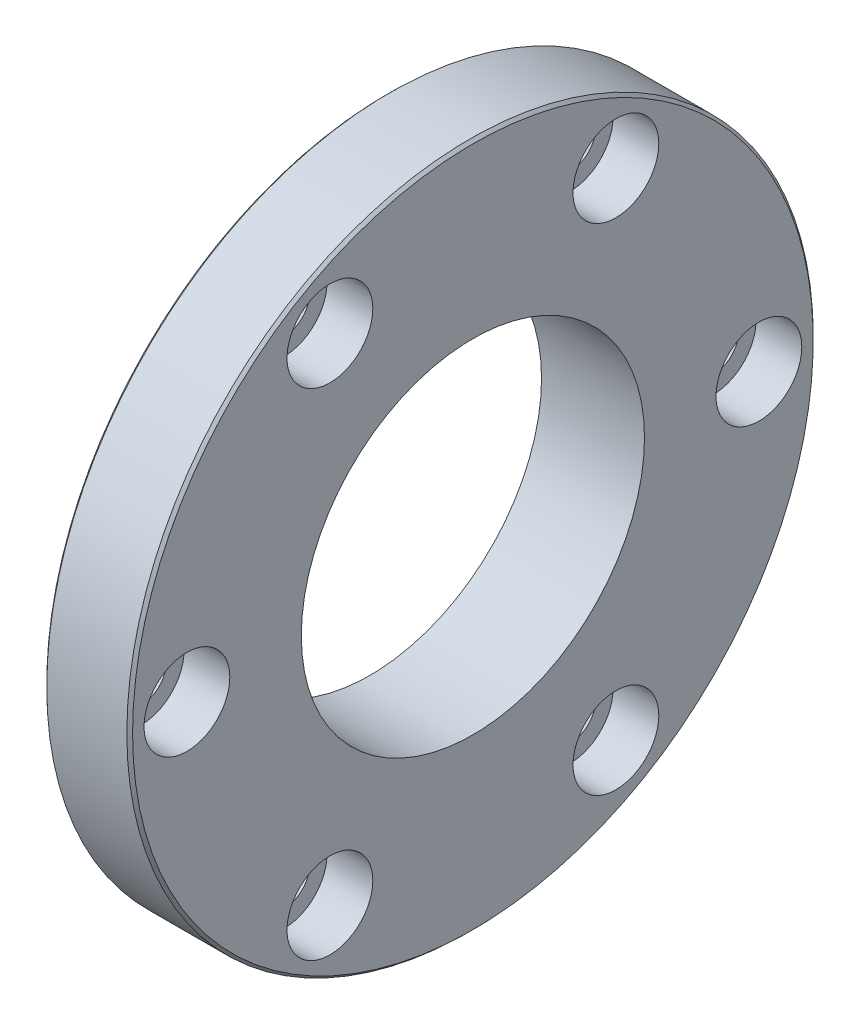
ISO-10303-21;
HEADER;
FILE_DESCRIPTION(('STEP AP214'),'2;1');
FILE_NAME('part.step','',(''),(''),'','','');
FILE_SCHEMA(('AUTOMOTIVE_DESIGN { 1 0 10303 214 1 1 1 1 }'));
ENDSEC;
DATA;
#1=APPLICATION_CONTEXT('core data for automotive mechanical design processes');
#2=APPLICATION_PROTOCOL_DEFINITION('international standard','automotive_design',2000,#1);
#3=PRODUCT_CONTEXT('',#1,'mechanical');
#4=PRODUCT('Part','Part','',(#3));
#5=PRODUCT_RELATED_PRODUCT_CATEGORY('part','',(#4));
#6=PRODUCT_DEFINITION_FORMATION('','',#4);
#7=PRODUCT_DEFINITION_CONTEXT('part definition',#1,'design');
#8=PRODUCT_DEFINITION('design','',#6,#7);
#9=PRODUCT_DEFINITION_SHAPE('','',#8);
#10=(LENGTH_UNIT() NAMED_UNIT(*) SI_UNIT(.MILLI.,.METRE.));
#11=(NAMED_UNIT(*) PLANE_ANGLE_UNIT() SI_UNIT($,.RADIAN.));
#12=(NAMED_UNIT(*) SI_UNIT($,.STERADIAN.) SOLID_ANGLE_UNIT());
#13=UNCERTAINTY_MEASURE_WITH_UNIT(LENGTH_MEASURE(1.E-05),#10,'distance_accuracy_value','');
#14=(GEOMETRIC_REPRESENTATION_CONTEXT(3) GLOBAL_UNCERTAINTY_ASSIGNED_CONTEXT((#13)) GLOBAL_UNIT_ASSIGNED_CONTEXT((#10,
#11,#12)) REPRESENTATION_CONTEXT('',''));
#15=CARTESIAN_POINT('',(0.,0.,0.));
#16=DIRECTION('',(0.,0.,1.));
#17=DIRECTION('',(1.,0.,0.));
#18=AXIS2_PLACEMENT_3D('',#15,#16,#17);
#19=CARTESIAN_POINT('',(-20.,35.,0.));
#20=DIRECTION('',(1.,0.,0.));
#21=DIRECTION('',(0.,0.,-1.));
#22=AXIS2_PLACEMENT_3D('',#19,#20,#21);
#23=PLANE('',#22);
#24=CARTESIAN_POINT('',(-20.,0.,0.));
#25=DIRECTION('',(1.,0.,0.));
#26=DIRECTION('',(0.,0.,-1.));
#27=AXIS2_PLACEMENT_3D('',#24,#25,#26);
#28=CIRCLE('',#27,39.5);
#29=CARTESIAN_POINT('',(-20.,0.,-39.5));
#30=VERTEX_POINT('',#29);
#31=EDGE_CURVE('E27',#30,#30,#28,.F.);
#32=ORIENTED_EDGE('',*,*,#31,.T.);
#33=EDGE_LOOP('',(#32));
#34=FACE_BOUND('',#33,.T.);
#35=CARTESIAN_POINT('',(-20.,0.,0.));
#36=DIRECTION('',(-1.,0.,0.));
#37=DIRECTION('',(0.,0.,1.));
#38=AXIS2_PLACEMENT_3D('',#35,#36,#37);
#39=CIRCLE('',#38,35.);
#40=CARTESIAN_POINT('',(-20.,0.,35.));
#41=VERTEX_POINT('',#40);
#42=EDGE_CURVE('E120',#41,#41,#39,.T.);
#43=ORIENTED_EDGE('',*,*,#42,.F.);
#44=EDGE_LOOP('',(#43));
#45=FACE_BOUND('',#44,.T.);
#46=ADVANCED_FACE('F14',(#34,#45),#23,.F.);
#47=CARTESIAN_POINT('',(-48.4195374503968,0.,0.));
#48=DIRECTION('',(-1.,0.,0.));
#49=DIRECTION('',(0.,0.,1.));
#50=AXIS2_PLACEMENT_3D('',#47,#48,#49);
#51=CYLINDRICAL_SURFACE('',#50,35.);
#52=CARTESIAN_POINT('',(-18.,0.,0.));
#53=DIRECTION('',(-1.,0.,0.));
#54=DIRECTION('',(0.,0.,1.));
#55=AXIS2_PLACEMENT_3D('',#52,#53,#54);
#56=CIRCLE('',#55,35.);
#57=CARTESIAN_POINT('',(-18.,0.,35.));
#58=VERTEX_POINT('',#57);
#59=EDGE_CURVE('E117',#58,#58,#56,.T.);
#60=ORIENTED_EDGE('',*,*,#59,.F.);
#61=EDGE_LOOP('',(#60));
#62=FACE_BOUND('',#61,.T.);
#63=ORIENTED_EDGE('',*,*,#42,.T.);
#64=EDGE_LOOP('',(#63));
#65=FACE_BOUND('',#64,.T.);
#66=ADVANCED_FACE('F153',(#62,#65),#51,.F.);
#67=CARTESIAN_POINT('',(-18.,30.,0.));
#68=DIRECTION('',(1.,0.,0.));
#69=DIRECTION('',(0.,0.,-1.));
#70=AXIS2_PLACEMENT_3D('',#67,#68,#69);
#71=PLANE('',#70);
#72=CARTESIAN_POINT('',(-18.,0.,0.));
#73=DIRECTION('',(-1.,0.,0.));
#74=DIRECTION('',(0.,0.,1.));
#75=AXIS2_PLACEMENT_3D('',#72,#73,#74);
#76=CIRCLE('',#75,30.);
#77=CARTESIAN_POINT('',(-18.,0.,30.));
#78=VERTEX_POINT('',#77);
#79=EDGE_CURVE('E114',#78,#78,#76,.T.);
#80=ORIENTED_EDGE('',*,*,#79,.F.);
#81=EDGE_LOOP('',(#80));
#82=FACE_BOUND('',#81,.T.);
#83=ORIENTED_EDGE('',*,*,#59,.T.);
#84=EDGE_LOOP('',(#83));
#85=FACE_BOUND('',#84,.T.);
#86=ADVANCED_FACE('F159',(#82,#85),#71,.F.);
#87=CARTESIAN_POINT('',(-48.4195374503968,0.,0.));
#88=DIRECTION('',(-1.,0.,0.));
#89=DIRECTION('',(0.,0.,1.));
#90=AXIS2_PLACEMENT_3D('',#87,#88,#89);
#91=CYLINDRICAL_SURFACE('',#90,30.);
#92=CARTESIAN_POINT('',(0.,0.,0.));
#93=DIRECTION('',(-1.,0.,0.));
#94=DIRECTION('',(0.,0.,1.));
#95=AXIS2_PLACEMENT_3D('',#92,#93,#94);
#96=CIRCLE('',#95,30.);
#97=CARTESIAN_POINT('',(0.,0.,30.));
#98=VERTEX_POINT('',#97);
#99=EDGE_CURVE('E111',#98,#98,#96,.T.);
#100=ORIENTED_EDGE('',*,*,#99,.F.);
#101=EDGE_LOOP('',(#100));
#102=FACE_BOUND('',#101,.T.);
#103=ORIENTED_EDGE('',*,*,#79,.T.);
#104=EDGE_LOOP('',(#103));
#105=FACE_BOUND('',#104,.T.);
#106=ADVANCED_FACE('F165',(#102,#105),#91,.F.);
#107=CARTESIAN_POINT('',(0.,60.,0.));
#108=DIRECTION('',(-1.,0.,0.));
#109=DIRECTION('',(0.,0.,1.));
#110=AXIS2_PLACEMENT_3D('',#107,#108,#109);
#111=PLANE('',#110);
#112=CARTESIAN_POINT('',(0.,-43.3012701892216,25.0000000000005));
#113=DIRECTION('',(1.,0.,0.));
#114=DIRECTION('',(0.,0.,-1.));
#115=AXIS2_PLACEMENT_3D('',#112,#113,#114);
#116=CIRCLE('',#115,7.5);
#117=CARTESIAN_POINT('',(0.,-43.3012701892216,17.5000000000005));
#118=VERTEX_POINT('',#117);
#119=EDGE_CURVE('E283',#118,#118,#116,.T.);
#120=ORIENTED_EDGE('',*,*,#119,.F.);
#121=EDGE_LOOP('',(#120));
#122=FACE_BOUND('',#121,.T.);
#123=CARTESIAN_POINT('',(0.,-43.3012701892221,-24.9999999999996));
#124=DIRECTION('',(1.,0.,0.));
#125=DIRECTION('',(0.,0.,-1.));
#126=AXIS2_PLACEMENT_3D('',#123,#124,#125);
#127=CIRCLE('',#126,7.5);
#128=CARTESIAN_POINT('',(0.,-43.3012701892221,-32.4999999999996));
#129=VERTEX_POINT('',#128);
#130=EDGE_CURVE('E65',#129,#129,#127,.T.);
#131=ORIENTED_EDGE('',*,*,#130,.F.);
#132=EDGE_LOOP('',(#131));
#133=FACE_BOUND('',#132,.T.);
#134=CARTESIAN_POINT('',(0.,0.,-50.));
#135=DIRECTION('',(1.,0.,0.));
#136=DIRECTION('',(0.,0.,-1.));
#137=AXIS2_PLACEMENT_3D('',#134,#135,#136);
#138=CIRCLE('',#137,7.5);
#139=CARTESIAN_POINT('',(0.,0.,-57.5));
#140=VERTEX_POINT('',#139);
#141=EDGE_CURVE('E52',#140,#140,#138,.T.);
#142=ORIENTED_EDGE('',*,*,#141,.F.);
#143=EDGE_LOOP('',(#142));
#144=FACE_BOUND('',#143,.T.);
#145=CARTESIAN_POINT('',(0.,43.3012701892218,-25.));
#146=DIRECTION('',(1.,0.,0.));
#147=DIRECTION('',(0.,0.,-1.));
#148=AXIS2_PLACEMENT_3D('',#145,#146,#147);
#149=CIRCLE('',#148,7.5);
#150=CARTESIAN_POINT('',(0.,43.3012701892218,-32.5));
#151=VERTEX_POINT('',#150);
#152=EDGE_CURVE('E48',#151,#151,#149,.T.);
#153=ORIENTED_EDGE('',*,*,#152,.F.);
#154=EDGE_LOOP('',(#153));
#155=FACE_BOUND('',#154,.T.);
#156=CARTESIAN_POINT('',(0.,43.301270189222,25.));
#157=DIRECTION('',(1.,0.,0.));
#158=DIRECTION('',(0.,0.,-1.));
#159=AXIS2_PLACEMENT_3D('',#156,#157,#158);
#160=CIRCLE('',#159,7.5);
#161=CARTESIAN_POINT('',(0.,43.301270189222,17.5));
#162=VERTEX_POINT('',#161);
#163=EDGE_CURVE('E44',#162,#162,#160,.T.);
#164=ORIENTED_EDGE('',*,*,#163,.F.);
#165=EDGE_LOOP('',(#164));
#166=FACE_BOUND('',#165,.T.);
#167=CARTESIAN_POINT('',(0.,0.,50.));
#168=DIRECTION('',(1.,0.,0.));
#169=DIRECTION('',(0.,0.,-1.));
#170=AXIS2_PLACEMENT_3D('',#167,#168,#169);
#171=CIRCLE('',#170,7.5);
#172=CARTESIAN_POINT('',(0.,0.,42.5));
#173=VERTEX_POINT('',#172);
#174=EDGE_CURVE('E39',#173,#173,#171,.T.);
#175=ORIENTED_EDGE('',*,*,#174,.F.);
#176=EDGE_LOOP('',(#175));
#177=FACE_BOUND('',#176,.T.);
#178=CARTESIAN_POINT('',(0.,0.,0.));
#179=DIRECTION('',(-1.,0.,0.));
#180=DIRECTION('',(0.,0.,1.));
#181=AXIS2_PLACEMENT_3D('',#178,#179,#180);
#182=CIRCLE('',#181,59.5);
#183=CARTESIAN_POINT('',(0.,0.,59.5));
#184=VERTEX_POINT('',#183);
#185=EDGE_CURVE('E129',#184,#184,#182,.F.);
#186=ORIENTED_EDGE('',*,*,#185,.T.);
#187=EDGE_LOOP('',(#186));
#188=FACE_BOUND('',#187,.T.);
#189=ORIENTED_EDGE('',*,*,#99,.T.);
#190=EDGE_LOOP('',(#189));
#191=FACE_BOUND('',#190,.T.);
#192=ADVANCED_FACE('F169',(#122,#133,#144,#155,#166,#177,#188,#191),#111,.F.);
#193=CARTESIAN_POINT('',(-48.4195374503968,0.,0.));
#194=DIRECTION('',(-1.,0.,0.));
#195=DIRECTION('',(0.,0.,1.));
#196=AXIS2_PLACEMENT_3D('',#193,#194,#195);
#197=CYLINDRICAL_SURFACE('',#196,60.);
#198=CARTESIAN_POINT('',(-0.500000000000007,0.,0.));
#199=DIRECTION('',(-1.,0.,0.));
#200=DIRECTION('',(0.,0.,1.));
#201=AXIS2_PLACEMENT_3D('',#198,#199,#200);
#202=CIRCLE('',#201,60.);
#203=CARTESIAN_POINT('',(-0.500000000000007,0.,60.));
#204=VERTEX_POINT('',#203);
#205=EDGE_CURVE('E126',#204,#204,#202,.T.);
#206=ORIENTED_EDGE('',*,*,#205,.T.);
#207=EDGE_LOOP('',(#206));
#208=FACE_BOUND('',#207,.T.);
#209=CARTESIAN_POINT('',(-14.5,0.,0.));
#210=DIRECTION('',(1.,0.,0.));
#211=DIRECTION('',(0.,0.,-1.));
#212=AXIS2_PLACEMENT_3D('',#209,#210,#211);
#213=CIRCLE('',#212,60.);
#214=CARTESIAN_POINT('',(-14.5,0.,-60.));
#215=VERTEX_POINT('',#214);
#216=EDGE_CURVE('E123',#215,#215,#213,.T.);
#217=ORIENTED_EDGE('',*,*,#216,.T.);
#218=EDGE_LOOP('',(#217));
#219=FACE_BOUND('',#218,.T.);
#220=ADVANCED_FACE('F173',(#208,#219),#197,.T.);
#221=CARTESIAN_POINT('',(-15.,42.,0.));
#222=DIRECTION('',(1.,0.,0.));
#223=DIRECTION('',(0.,0.,-1.));
#224=AXIS2_PLACEMENT_3D('',#221,#222,#223);
#225=PLANE('',#224);
#226=CARTESIAN_POINT('',(-15.,-43.3012701892216,25.0000000000005));
#227=DIRECTION('',(1.,0.,0.));
#228=DIRECTION('',(0.,0.,-1.));
#229=AXIS2_PLACEMENT_3D('',#226,#227,#228);
#230=CIRCLE('',#229,4.5);
#231=CARTESIAN_POINT('',(-15.,-43.3012701892216,20.5000000000005));
#232=VERTEX_POINT('',#231);
#233=EDGE_CURVE('E18',#232,#232,#230,.T.);
#234=ORIENTED_EDGE('',*,*,#233,.T.);
#235=EDGE_LOOP('',(#234));
#236=FACE_BOUND('',#235,.T.);
#237=CARTESIAN_POINT('',(-15.,-43.3012701892221,-24.9999999999996));
#238=DIRECTION('',(1.,0.,0.));
#239=DIRECTION('',(0.,0.,-1.));
#240=AXIS2_PLACEMENT_3D('',#237,#238,#239);
#241=CIRCLE('',#240,4.5);
#242=CARTESIAN_POINT('',(-15.,-43.3012701892221,-29.4999999999996));
#243=VERTEX_POINT('',#242);
#244=EDGE_CURVE('E50',#243,#243,#241,.T.);
#245=ORIENTED_EDGE('',*,*,#244,.T.);
#246=EDGE_LOOP('',(#245));
#247=FACE_BOUND('',#246,.T.);
#248=CARTESIAN_POINT('',(-15.,0.,-50.));
#249=DIRECTION('',(1.,0.,0.));
#250=DIRECTION('',(0.,0.,-1.));
#251=AXIS2_PLACEMENT_3D('',#248,#249,#250);
#252=CIRCLE('',#251,4.5);
#253=CARTESIAN_POINT('',(-15.,0.,-54.5));
#254=VERTEX_POINT('',#253);
#255=EDGE_CURVE('E46',#254,#254,#252,.T.);
#256=ORIENTED_EDGE('',*,*,#255,.T.);
#257=EDGE_LOOP('',(#256));
#258=FACE_BOUND('',#257,.T.);
#259=CARTESIAN_POINT('',(-15.,43.3012701892218,-25.));
#260=DIRECTION('',(1.,0.,0.));
#261=DIRECTION('',(0.,0.,-1.));
#262=AXIS2_PLACEMENT_3D('',#259,#260,#261);
#263=CIRCLE('',#262,4.5);
#264=CARTESIAN_POINT('',(-15.,43.3012701892218,-29.5));
#265=VERTEX_POINT('',#264);
#266=EDGE_CURVE('E41',#265,#265,#263,.T.);
#267=ORIENTED_EDGE('',*,*,#266,.T.);
#268=EDGE_LOOP('',(#267));
#269=FACE_BOUND('',#268,.T.);
#270=CARTESIAN_POINT('',(-15.,43.301270189222,25.));
#271=DIRECTION('',(1.,0.,0.));
#272=DIRECTION('',(0.,0.,-1.));
#273=AXIS2_PLACEMENT_3D('',#270,#271,#272);
#274=CIRCLE('',#273,4.5);
#275=CARTESIAN_POINT('',(-15.,43.301270189222,20.5));
#276=VERTEX_POINT('',#275);
#277=EDGE_CURVE('E36',#276,#276,#274,.T.);
#278=ORIENTED_EDGE('',*,*,#277,.T.);
#279=EDGE_LOOP('',(#278));
#280=FACE_BOUND('',#279,.T.);
#281=CARTESIAN_POINT('',(-15.,0.,50.));
#282=DIRECTION('',(1.,0.,0.));
#283=DIRECTION('',(0.,0.,-1.));
#284=AXIS2_PLACEMENT_3D('',#281,#282,#283);
#285=CIRCLE('',#284,4.5);
#286=CARTESIAN_POINT('',(-15.,0.,45.5));
#287=VERTEX_POINT('',#286);
#288=EDGE_CURVE('E31',#287,#287,#285,.T.);
#289=ORIENTED_EDGE('',*,*,#288,.T.);
#290=EDGE_LOOP('',(#289));
#291=FACE_BOUND('',#290,.T.);
#292=CARTESIAN_POINT('',(-15.,0.,0.));
#293=DIRECTION('',(1.,0.,0.));
#294=DIRECTION('',(0.,0.,-1.));
#295=AXIS2_PLACEMENT_3D('',#292,#293,#294);
#296=CIRCLE('',#295,59.5);
#297=CARTESIAN_POINT('',(-15.,0.,-59.5));
#298=VERTEX_POINT('',#297);
#299=EDGE_CURVE('E10',#298,#298,#296,.F.);
#300=ORIENTED_EDGE('',*,*,#299,.T.);
#301=EDGE_LOOP('',(#300));
#302=FACE_BOUND('',#301,.T.);
#303=CARTESIAN_POINT('',(-15.,0.,0.));
#304=DIRECTION('',(-1.,0.,0.));
#305=DIRECTION('',(0.,0.,1.));
#306=AXIS2_PLACEMENT_3D('',#303,#304,#305);
#307=CIRCLE('',#306,42.);
#308=CARTESIAN_POINT('',(-15.,0.,42.));
#309=VERTEX_POINT('',#308);
#310=EDGE_CURVE('E108',#309,#309,#307,.T.);
#311=ORIENTED_EDGE('',*,*,#310,.F.);
#312=EDGE_LOOP('',(#311));
#313=FACE_BOUND('',#312,.T.);
#314=ADVANCED_FACE('F177',(#236,#247,#258,#269,#280,#291,#302,#313),#225,.F.);
#315=CARTESIAN_POINT('',(-15.,0.,0.));
#316=DIRECTION('',(-1.,0.,0.));
#317=DIRECTION('',(0.,0.,1.));
#318=AXIS2_PLACEMENT_3D('',#315,#316,#317);
#319=CONICAL_SURFACE('',#318,42.,0.785398163397455);
#320=CARTESIAN_POINT('',(-14.5,0.,0.));
#321=DIRECTION('',(-1.,0.,0.));
#322=DIRECTION('',(0.,0.,1.));
#323=AXIS2_PLACEMENT_3D('',#320,#321,#322);
#324=CIRCLE('',#323,41.5);
#325=CARTESIAN_POINT('',(-14.5,0.,41.5));
#326=VERTEX_POINT('',#325);
#327=EDGE_CURVE('E105',#326,#326,#324,.T.);
#328=ORIENTED_EDGE('',*,*,#327,.F.);
#329=EDGE_LOOP('',(#328));
#330=FACE_BOUND('',#329,.T.);
#331=ORIENTED_EDGE('',*,*,#310,.T.);
#332=EDGE_LOOP('',(#331));
#333=FACE_BOUND('',#332,.T.);
#334=ADVANCED_FACE('F181',(#330,#333),#319,.F.);
#335=CARTESIAN_POINT('',(-14.5,41.5,0.));
#336=DIRECTION('',(1.,0.,0.));
#337=DIRECTION('',(0.,0.,-1.));
#338=AXIS2_PLACEMENT_3D('',#335,#336,#337);
#339=PLANE('',#338);
#340=CARTESIAN_POINT('',(-14.5,0.,0.));
#341=DIRECTION('',(-1.,0.,0.));
#342=DIRECTION('',(0.,0.,1.));
#343=AXIS2_PLACEMENT_3D('',#340,#341,#342);
#344=CIRCLE('',#343,40.);
#345=CARTESIAN_POINT('',(-14.5,0.,40.));
#346=VERTEX_POINT('',#345);
#347=EDGE_CURVE('E102',#346,#346,#344,.T.);
#348=ORIENTED_EDGE('',*,*,#347,.F.);
#349=EDGE_LOOP('',(#348));
#350=FACE_BOUND('',#349,.T.);
#351=ORIENTED_EDGE('',*,*,#327,.T.);
#352=EDGE_LOOP('',(#351));
#353=FACE_BOUND('',#352,.T.);
#354=ADVANCED_FACE('F185',(#350,#353),#339,.F.);
#355=CARTESIAN_POINT('',(-15.,0.,0.));
#356=DIRECTION('',(-1.,0.,0.));
#357=DIRECTION('',(0.,0.,1.));
#358=AXIS2_PLACEMENT_3D('',#355,#356,#357);
#359=TOROIDAL_SURFACE('',#358,40.,0.5);
#360=CARTESIAN_POINT('',(-15.,0.,0.));
#361=DIRECTION('',(-1.,0.,0.));
#362=DIRECTION('',(0.,0.,1.));
#363=AXIS2_PLACEMENT_3D('',#360,#361,#362);
#364=CIRCLE('',#363,39.5);
#365=CARTESIAN_POINT('',(-15.,0.,39.5));
#366=VERTEX_POINT('',#365);
#367=EDGE_CURVE('E99',#366,#366,#364,.T.);
#368=ORIENTED_EDGE('',*,*,#367,.F.);
#369=EDGE_LOOP('',(#368));
#370=FACE_BOUND('',#369,.T.);
#371=ORIENTED_EDGE('',*,*,#347,.T.);
#372=EDGE_LOOP('',(#371));
#373=FACE_BOUND('',#372,.T.);
#374=ADVANCED_FACE('F189',(#370,#373),#359,.F.);
#375=CARTESIAN_POINT('',(-48.4195374503968,0.,0.));
#376=DIRECTION('',(-1.,0.,0.));
#377=DIRECTION('',(0.,0.,1.));
#378=AXIS2_PLACEMENT_3D('',#375,#376,#377);
#379=CYLINDRICAL_SURFACE('',#378,39.5);
#380=CARTESIAN_POINT('',(-16.5,0.,0.));
#381=DIRECTION('',(-1.,0.,0.));
#382=DIRECTION('',(0.,0.,1.));
#383=AXIS2_PLACEMENT_3D('',#380,#381,#382);
#384=CIRCLE('',#383,39.5);
#385=CARTESIAN_POINT('',(-16.5,0.,39.5));
#386=VERTEX_POINT('',#385);
#387=EDGE_CURVE('E96',#386,#386,#384,.T.);
#388=ORIENTED_EDGE('',*,*,#387,.F.);
#389=EDGE_LOOP('',(#388));
#390=FACE_BOUND('',#389,.T.);
#391=ORIENTED_EDGE('',*,*,#367,.T.);
#392=EDGE_LOOP('',(#391));
#393=FACE_BOUND('',#392,.T.);
#394=ADVANCED_FACE('F193',(#390,#393),#379,.T.);
#395=CARTESIAN_POINT('',(-16.5,0.,0.));
#396=DIRECTION('',(-1.,0.,0.));
#397=DIRECTION('',(0.,0.,1.));
#398=AXIS2_PLACEMENT_3D('',#395,#396,#397);
#399=CONICAL_SURFACE('',#398,39.5,0.785398163397442);
#400=CARTESIAN_POINT('',(-17.,0.,0.));
#401=DIRECTION('',(-1.,0.,0.));
#402=DIRECTION('',(0.,0.,1.));
#403=AXIS2_PLACEMENT_3D('',#400,#401,#402);
#404=CIRCLE('',#403,40.);
#405=CARTESIAN_POINT('',(-17.,0.,40.));
#406=VERTEX_POINT('',#405);
#407=EDGE_CURVE('E34',#406,#406,#404,.T.);
#408=ORIENTED_EDGE('',*,*,#407,.F.);
#409=EDGE_LOOP('',(#408));
#410=FACE_BOUND('',#409,.T.);
#411=ORIENTED_EDGE('',*,*,#387,.T.);
#412=EDGE_LOOP('',(#411));
#413=FACE_BOUND('',#412,.T.);
#414=ADVANCED_FACE('F197',(#410,#413),#399,.T.);
#415=CARTESIAN_POINT('',(-48.4195374503968,0.,0.));
#416=DIRECTION('',(-1.,0.,0.));
#417=DIRECTION('',(0.,0.,1.));
#418=AXIS2_PLACEMENT_3D('',#415,#416,#417);
#419=CYLINDRICAL_SURFACE('',#418,40.);
#420=CARTESIAN_POINT('',(-19.5,0.,0.));
#421=DIRECTION('',(1.,0.,0.));
#422=DIRECTION('',(0.,0.,-1.));
#423=AXIS2_PLACEMENT_3D('',#420,#421,#422);
#424=CIRCLE('',#423,40.);
#425=CARTESIAN_POINT('',(-19.5,0.,-40.));
#426=VERTEX_POINT('',#425);
#427=EDGE_CURVE('E22',#426,#426,#424,.T.);
#428=ORIENTED_EDGE('',*,*,#427,.T.);
#429=EDGE_LOOP('',(#428));
#430=FACE_BOUND('',#429,.T.);
#431=ORIENTED_EDGE('',*,*,#407,.T.);
#432=EDGE_LOOP('',(#431));
#433=FACE_BOUND('',#432,.T.);
#434=ADVANCED_FACE('F148',(#430,#433),#419,.T.);
#435=CARTESIAN_POINT('',(-0.500000000000007,0.,0.));
#436=DIRECTION('',(-1.,0.,0.));
#437=DIRECTION('',(0.,0.,1.));
#438=AXIS2_PLACEMENT_3D('',#435,#436,#437);
#439=CONICAL_SURFACE('',#438,60.,0.785398163397455);
#440=ORIENTED_EDGE('',*,*,#185,.F.);
#441=EDGE_LOOP('',(#440));
#442=FACE_BOUND('',#441,.T.);
#443=ORIENTED_EDGE('',*,*,#205,.F.);
#444=EDGE_LOOP('',(#443));
#445=FACE_BOUND('',#444,.T.);
#446=ADVANCED_FACE('F138',(#442,#445),#439,.T.);
#447=CARTESIAN_POINT('',(-20.,0.,0.));
#448=DIRECTION('',(1.,0.,0.));
#449=DIRECTION('',(0.,0.,-1.));
#450=AXIS2_PLACEMENT_3D('',#447,#448,#449);
#451=CONICAL_SURFACE('',#450,39.5,0.785398163397462);
#452=ORIENTED_EDGE('',*,*,#427,.F.);
#453=EDGE_LOOP('',(#452));
#454=FACE_BOUND('',#453,.T.);
#455=ORIENTED_EDGE('',*,*,#31,.F.);
#456=EDGE_LOOP('',(#455));
#457=FACE_BOUND('',#456,.T.);
#458=ADVANCED_FACE('F136',(#454,#457),#451,.T.);
#459=CARTESIAN_POINT('',(-15.,0.,0.));
#460=DIRECTION('',(1.,0.,0.));
#461=DIRECTION('',(0.,0.,-1.));
#462=AXIS2_PLACEMENT_3D('',#459,#460,#461);
#463=CONICAL_SURFACE('',#462,59.5,0.785398163397469);
#464=ORIENTED_EDGE('',*,*,#216,.F.);
#465=EDGE_LOOP('',(#464));
#466=FACE_BOUND('',#465,.T.);
#467=ORIENTED_EDGE('',*,*,#299,.F.);
#468=EDGE_LOOP('',(#467));
#469=FACE_BOUND('',#468,.T.);
#470=ADVANCED_FACE('F16',(#466,#469),#463,.T.);
#471=CARTESIAN_POINT('',(0.,0.,50.));
#472=DIRECTION('',(1.,0.,0.));
#473=DIRECTION('',(0.,0.,-1.));
#474=AXIS2_PLACEMENT_3D('',#471,#472,#473);
#475=CYLINDRICAL_SURFACE('',#474,4.5);
#476=CARTESIAN_POINT('',(-8.,0.,50.));
#477=DIRECTION('',(1.,0.,0.));
#478=DIRECTION('',(0.,0.,-1.));
#479=AXIS2_PLACEMENT_3D('',#476,#477,#478);
#480=CIRCLE('',#479,4.5);
#481=CARTESIAN_POINT('',(-8.,0.,45.5));
#482=VERTEX_POINT('',#481);
#483=EDGE_CURVE('E35',#482,#482,#480,.T.);
#484=ORIENTED_EDGE('',*,*,#483,.T.);
#485=EDGE_LOOP('',(#484));
#486=FACE_BOUND('',#485,.T.);
#487=ORIENTED_EDGE('',*,*,#288,.F.);
#488=EDGE_LOOP('',(#487));
#489=FACE_BOUND('',#488,.T.);
#490=ADVANCED_FACE('F146',(#486,#489),#475,.F.);
#491=CARTESIAN_POINT('',(-8.,4.5,50.));
#492=DIRECTION('',(-1.,0.,0.));
#493=DIRECTION('',(0.,0.,1.));
#494=AXIS2_PLACEMENT_3D('',#491,#492,#493);
#495=PLANE('',#494);
#496=ORIENTED_EDGE('',*,*,#483,.F.);
#497=EDGE_LOOP('',(#496));
#498=FACE_BOUND('',#497,.T.);
#499=CARTESIAN_POINT('',(-8.,0.,50.));
#500=DIRECTION('',(1.,0.,0.));
#501=DIRECTION('',(0.,0.,-1.));
#502=AXIS2_PLACEMENT_3D('',#499,#500,#501);
#503=CIRCLE('',#502,7.5);
#504=CARTESIAN_POINT('',(-8.,0.,42.5));
#505=VERTEX_POINT('',#504);
#506=EDGE_CURVE('E89',#505,#505,#503,.T.);
#507=ORIENTED_EDGE('',*,*,#506,.T.);
#508=EDGE_LOOP('',(#507));
#509=FACE_BOUND('',#508,.T.);
#510=ADVANCED_FACE('F207',(#498,#509),#495,.F.);
#511=CARTESIAN_POINT('',(0.,0.,50.));
#512=DIRECTION('',(1.,0.,0.));
#513=DIRECTION('',(0.,0.,-1.));
#514=AXIS2_PLACEMENT_3D('',#511,#512,#513);
#515=CYLINDRICAL_SURFACE('',#514,7.5);
#516=ORIENTED_EDGE('',*,*,#506,.F.);
#517=EDGE_LOOP('',(#516));
#518=FACE_BOUND('',#517,.T.);
#519=ORIENTED_EDGE('',*,*,#174,.T.);
#520=EDGE_LOOP('',(#519));
#521=FACE_BOUND('',#520,.T.);
#522=ADVANCED_FACE('F211',(#518,#521),#515,.F.);
#523=CARTESIAN_POINT('',(0.,43.301270189222,25.));
#524=DIRECTION('',(1.,0.,0.));
#525=DIRECTION('',(0.,0.,-1.));
#526=AXIS2_PLACEMENT_3D('',#523,#524,#525);
#527=CYLINDRICAL_SURFACE('',#526,4.5);
#528=CARTESIAN_POINT('',(-8.,43.301270189222,25.));
#529=DIRECTION('',(1.,0.,0.));
#530=DIRECTION('',(0.,0.,-1.));
#531=AXIS2_PLACEMENT_3D('',#528,#529,#530);
#532=CIRCLE('',#531,4.5);
#533=CARTESIAN_POINT('',(-8.,43.301270189222,20.5));
#534=VERTEX_POINT('',#533);
#535=EDGE_CURVE('E40',#534,#534,#532,.T.);
#536=ORIENTED_EDGE('',*,*,#535,.T.);
#537=EDGE_LOOP('',(#536));
#538=FACE_BOUND('',#537,.T.);
#539=ORIENTED_EDGE('',*,*,#277,.F.);
#540=EDGE_LOOP('',(#539));
#541=FACE_BOUND('',#540,.T.);
#542=ADVANCED_FACE('F215',(#538,#541),#527,.F.);
#543=CARTESIAN_POINT('',(-8.,47.801270189222,25.));
#544=DIRECTION('',(-1.,0.,0.));
#545=DIRECTION('',(0.,0.,1.));
#546=AXIS2_PLACEMENT_3D('',#543,#544,#545);
#547=PLANE('',#546);
#548=ORIENTED_EDGE('',*,*,#535,.F.);
#549=EDGE_LOOP('',(#548));
#550=FACE_BOUND('',#549,.T.);
#551=CARTESIAN_POINT('',(-8.,43.301270189222,25.));
#552=DIRECTION('',(1.,0.,0.));
#553=DIRECTION('',(0.,0.,-1.));
#554=AXIS2_PLACEMENT_3D('',#551,#552,#553);
#555=CIRCLE('',#554,7.5);
#556=CARTESIAN_POINT('',(-8.,43.301270189222,17.5));
#557=VERTEX_POINT('',#556);
#558=EDGE_CURVE('E82',#557,#557,#555,.T.);
#559=ORIENTED_EDGE('',*,*,#558,.T.);
#560=EDGE_LOOP('',(#559));
#561=FACE_BOUND('',#560,.T.);
#562=ADVANCED_FACE('F219',(#550,#561),#547,.F.);
#563=CARTESIAN_POINT('',(0.,43.301270189222,25.));
#564=DIRECTION('',(1.,0.,0.));
#565=DIRECTION('',(0.,0.,-1.));
#566=AXIS2_PLACEMENT_3D('',#563,#564,#565);
#567=CYLINDRICAL_SURFACE('',#566,7.5);
#568=ORIENTED_EDGE('',*,*,#558,.F.);
#569=EDGE_LOOP('',(#568));
#570=FACE_BOUND('',#569,.T.);
#571=ORIENTED_EDGE('',*,*,#163,.T.);
#572=EDGE_LOOP('',(#571));
#573=FACE_BOUND('',#572,.T.);
#574=ADVANCED_FACE('F223',(#570,#573),#567,.F.);
#575=CARTESIAN_POINT('',(0.,43.3012701892218,-25.));
#576=DIRECTION('',(1.,0.,0.));
#577=DIRECTION('',(0.,0.,-1.));
#578=AXIS2_PLACEMENT_3D('',#575,#576,#577);
#579=CYLINDRICAL_SURFACE('',#578,4.5);
#580=CARTESIAN_POINT('',(-8.,43.3012701892218,-25.));
#581=DIRECTION('',(1.,0.,0.));
#582=DIRECTION('',(0.,0.,-1.));
#583=AXIS2_PLACEMENT_3D('',#580,#581,#582);
#584=CIRCLE('',#583,4.5);
#585=CARTESIAN_POINT('',(-8.,43.3012701892218,-29.5));
#586=VERTEX_POINT('',#585);
#587=EDGE_CURVE('E45',#586,#586,#584,.T.);
#588=ORIENTED_EDGE('',*,*,#587,.T.);
#589=EDGE_LOOP('',(#588));
#590=FACE_BOUND('',#589,.T.);
#591=ORIENTED_EDGE('',*,*,#266,.F.);
#592=EDGE_LOOP('',(#591));
#593=FACE_BOUND('',#592,.T.);
#594=ADVANCED_FACE('F227',(#590,#593),#579,.F.);
#595=CARTESIAN_POINT('',(-8.,47.8012701892218,-25.));
#596=DIRECTION('',(-1.,0.,0.));
#597=DIRECTION('',(0.,0.,1.));
#598=AXIS2_PLACEMENT_3D('',#595,#596,#597);
#599=PLANE('',#598);
#600=ORIENTED_EDGE('',*,*,#587,.F.);
#601=EDGE_LOOP('',(#600));
#602=FACE_BOUND('',#601,.T.);
#603=CARTESIAN_POINT('',(-8.,43.3012701892218,-25.));
#604=DIRECTION('',(1.,0.,0.));
#605=DIRECTION('',(0.,0.,-1.));
#606=AXIS2_PLACEMENT_3D('',#603,#604,#605);
#607=CIRCLE('',#606,7.5);
#608=CARTESIAN_POINT('',(-8.,43.3012701892218,-32.5));
#609=VERTEX_POINT('',#608);
#610=EDGE_CURVE('E75',#609,#609,#607,.T.);
#611=ORIENTED_EDGE('',*,*,#610,.T.);
#612=EDGE_LOOP('',(#611));
#613=FACE_BOUND('',#612,.T.);
#614=ADVANCED_FACE('F231',(#602,#613),#599,.F.);
#615=CARTESIAN_POINT('',(0.,43.3012701892218,-25.));
#616=DIRECTION('',(1.,0.,0.));
#617=DIRECTION('',(0.,0.,-1.));
#618=AXIS2_PLACEMENT_3D('',#615,#616,#617);
#619=CYLINDRICAL_SURFACE('',#618,7.5);
#620=ORIENTED_EDGE('',*,*,#610,.F.);
#621=EDGE_LOOP('',(#620));
#622=FACE_BOUND('',#621,.T.);
#623=ORIENTED_EDGE('',*,*,#152,.T.);
#624=EDGE_LOOP('',(#623));
#625=FACE_BOUND('',#624,.T.);
#626=ADVANCED_FACE('F235',(#622,#625),#619,.F.);
#627=CARTESIAN_POINT('',(0.,0.,-50.));
#628=DIRECTION('',(1.,0.,0.));
#629=DIRECTION('',(0.,0.,-1.));
#630=AXIS2_PLACEMENT_3D('',#627,#628,#629);
#631=CYLINDRICAL_SURFACE('',#630,4.5);
#632=CARTESIAN_POINT('',(-8.,0.,-50.));
#633=DIRECTION('',(1.,0.,0.));
#634=DIRECTION('',(0.,0.,-1.));
#635=AXIS2_PLACEMENT_3D('',#632,#633,#634);
#636=CIRCLE('',#635,4.5);
#637=CARTESIAN_POINT('',(-8.,0.,-54.5));
#638=VERTEX_POINT('',#637);
#639=EDGE_CURVE('E49',#638,#638,#636,.T.);
#640=ORIENTED_EDGE('',*,*,#639,.T.);
#641=EDGE_LOOP('',(#640));
#642=FACE_BOUND('',#641,.T.);
#643=ORIENTED_EDGE('',*,*,#255,.F.);
#644=EDGE_LOOP('',(#643));
#645=FACE_BOUND('',#644,.T.);
#646=ADVANCED_FACE('F239',(#642,#645),#631,.F.);
#647=CARTESIAN_POINT('',(-8.,4.5,-50.));
#648=DIRECTION('',(-1.,0.,0.));
#649=DIRECTION('',(0.,0.,1.));
#650=AXIS2_PLACEMENT_3D('',#647,#648,#649);
#651=PLANE('',#650);
#652=ORIENTED_EDGE('',*,*,#639,.F.);
#653=EDGE_LOOP('',(#652));
#654=FACE_BOUND('',#653,.T.);
#655=CARTESIAN_POINT('',(-8.,0.,-50.));
#656=DIRECTION('',(1.,0.,0.));
#657=DIRECTION('',(0.,0.,-1.));
#658=AXIS2_PLACEMENT_3D('',#655,#656,#657);
#659=CIRCLE('',#658,7.5);
#660=CARTESIAN_POINT('',(-8.,0.,-57.5));
#661=VERTEX_POINT('',#660);
#662=EDGE_CURVE('E57',#661,#661,#659,.T.);
#663=ORIENTED_EDGE('',*,*,#662,.T.);
#664=EDGE_LOOP('',(#663));
#665=FACE_BOUND('',#664,.T.);
#666=ADVANCED_FACE('F243',(#654,#665),#651,.F.);
#667=CARTESIAN_POINT('',(0.,0.,-50.));
#668=DIRECTION('',(1.,0.,0.));
#669=DIRECTION('',(0.,0.,-1.));
#670=AXIS2_PLACEMENT_3D('',#667,#668,#669);
#671=CYLINDRICAL_SURFACE('',#670,7.5);
#672=ORIENTED_EDGE('',*,*,#662,.F.);
#673=EDGE_LOOP('',(#672));
#674=FACE_BOUND('',#673,.T.);
#675=ORIENTED_EDGE('',*,*,#141,.T.);
#676=EDGE_LOOP('',(#675));
#677=FACE_BOUND('',#676,.T.);
#678=ADVANCED_FACE('F247',(#674,#677),#671,.F.);
#679=CARTESIAN_POINT('',(0.,-43.3012701892221,-24.9999999999996));
#680=DIRECTION('',(1.,0.,0.));
#681=DIRECTION('',(0.,0.,-1.));
#682=AXIS2_PLACEMENT_3D('',#679,#680,#681);
#683=CYLINDRICAL_SURFACE('',#682,4.5);
#684=CARTESIAN_POINT('',(-8.,-43.3012701892221,-24.9999999999996));
#685=DIRECTION('',(1.,0.,0.));
#686=DIRECTION('',(0.,0.,-1.));
#687=AXIS2_PLACEMENT_3D('',#684,#685,#686);
#688=CIRCLE('',#687,4.5);
#689=CARTESIAN_POINT('',(-8.,-43.3012701892221,-29.4999999999996));
#690=VERTEX_POINT('',#689);
#691=EDGE_CURVE('E53',#690,#690,#688,.T.);
#692=ORIENTED_EDGE('',*,*,#691,.T.);
#693=EDGE_LOOP('',(#692));
#694=FACE_BOUND('',#693,.T.);
#695=ORIENTED_EDGE('',*,*,#244,.F.);
#696=EDGE_LOOP('',(#695));
#697=FACE_BOUND('',#696,.T.);
#698=ADVANCED_FACE('F251',(#694,#697),#683,.F.);
#699=CARTESIAN_POINT('',(-8.,-38.8012701892222,-24.9999999999996));
#700=DIRECTION('',(-1.,0.,0.));
#701=DIRECTION('',(0.,0.,1.));
#702=AXIS2_PLACEMENT_3D('',#699,#700,#701);
#703=PLANE('',#702);
#704=ORIENTED_EDGE('',*,*,#691,.F.);
#705=EDGE_LOOP('',(#704));
#706=FACE_BOUND('',#705,.T.);
#707=CARTESIAN_POINT('',(-8.,-43.3012701892221,-24.9999999999996));
#708=DIRECTION('',(1.,0.,0.));
#709=DIRECTION('',(0.,0.,-1.));
#710=AXIS2_PLACEMENT_3D('',#707,#708,#709);
#711=CIRCLE('',#710,7.5);
#712=CARTESIAN_POINT('',(-8.,-43.3012701892221,-32.4999999999996));
#713=VERTEX_POINT('',#712);
#714=EDGE_CURVE('E60',#713,#713,#711,.T.);
#715=ORIENTED_EDGE('',*,*,#714,.T.);
#716=EDGE_LOOP('',(#715));
#717=FACE_BOUND('',#716,.T.);
#718=ADVANCED_FACE('F255',(#706,#717),#703,.F.);
#719=CARTESIAN_POINT('',(0.,-43.3012701892221,-24.9999999999996));
#720=DIRECTION('',(1.,0.,0.));
#721=DIRECTION('',(0.,0.,-1.));
#722=AXIS2_PLACEMENT_3D('',#719,#720,#721);
#723=CYLINDRICAL_SURFACE('',#722,7.5);
#724=ORIENTED_EDGE('',*,*,#714,.F.);
#725=EDGE_LOOP('',(#724));
#726=FACE_BOUND('',#725,.T.);
#727=ORIENTED_EDGE('',*,*,#130,.T.);
#728=EDGE_LOOP('',(#727));
#729=FACE_BOUND('',#728,.T.);
#730=ADVANCED_FACE('F258',(#726,#729),#723,.F.);
#731=CARTESIAN_POINT('',(0.,-43.3012701892216,25.0000000000005));
#732=DIRECTION('',(1.,0.,0.));
#733=DIRECTION('',(0.,0.,-1.));
#734=AXIS2_PLACEMENT_3D('',#731,#732,#733);
#735=CYLINDRICAL_SURFACE('',#734,4.5);
#736=CARTESIAN_POINT('',(-8.,-43.3012701892216,25.0000000000005));
#737=DIRECTION('',(1.,0.,0.));
#738=DIRECTION('',(0.,0.,-1.));
#739=AXIS2_PLACEMENT_3D('',#736,#737,#738);
#740=CIRCLE('',#739,4.5);
#741=CARTESIAN_POINT('',(-8.,-43.3012701892216,20.5000000000005));
#742=VERTEX_POINT('',#741);
#743=EDGE_CURVE('E285',#742,#742,#740,.T.);
#744=ORIENTED_EDGE('',*,*,#743,.T.);
#745=EDGE_LOOP('',(#744));
#746=FACE_BOUND('',#745,.T.);
#747=ORIENTED_EDGE('',*,*,#233,.F.);
#748=EDGE_LOOP('',(#747));
#749=FACE_BOUND('',#748,.T.);
#750=ADVANCED_FACE('F262',(#746,#749),#735,.F.);
#751=CARTESIAN_POINT('',(-8.,-38.8012701892217,25.0000000000005));
#752=DIRECTION('',(-1.,0.,0.));
#753=DIRECTION('',(0.,0.,1.));
#754=AXIS2_PLACEMENT_3D('',#751,#752,#753);
#755=PLANE('',#754);
#756=ORIENTED_EDGE('',*,*,#743,.F.);
#757=EDGE_LOOP('',(#756));
#758=FACE_BOUND('',#757,.T.);
#759=CARTESIAN_POINT('',(-8.,-43.3012701892216,25.0000000000005));
#760=DIRECTION('',(1.,0.,0.));
#761=DIRECTION('',(0.,0.,-1.));
#762=AXIS2_PLACEMENT_3D('',#759,#760,#761);
#763=CIRCLE('',#762,7.5);
#764=CARTESIAN_POINT('',(-8.,-43.3012701892216,17.5000000000005));
#765=VERTEX_POINT('',#764);
#766=EDGE_CURVE('E280',#765,#765,#763,.T.);
#767=ORIENTED_EDGE('',*,*,#766,.T.);
#768=EDGE_LOOP('',(#767));
#769=FACE_BOUND('',#768,.T.);
#770=ADVANCED_FACE('F266',(#758,#769),#755,.F.);
#771=CARTESIAN_POINT('',(0.,-43.3012701892216,25.0000000000005));
#772=DIRECTION('',(1.,0.,0.));
#773=DIRECTION('',(0.,0.,-1.));
#774=AXIS2_PLACEMENT_3D('',#771,#772,#773);
#775=CYLINDRICAL_SURFACE('',#774,7.5);
#776=ORIENTED_EDGE('',*,*,#766,.F.);
#777=EDGE_LOOP('',(#776));
#778=FACE_BOUND('',#777,.T.);
#779=ORIENTED_EDGE('',*,*,#119,.T.);
#780=EDGE_LOOP('',(#779));
#781=FACE_BOUND('',#780,.T.);
#782=ADVANCED_FACE('F270',(#778,#781),#775,.F.);
#783=CLOSED_SHELL('',(#46,#66,#86,#106,#192,#220,#314,#334,#354,#374,#394,#414,#434,#446,#458,
#470,#490,#510,#522,#542,#562,#574,#594,#614,#626,#646,#666,#678,#698,#718,#730,#750,#770,#782));
#784=MANIFOLD_SOLID_BREP('B1',#783);
#785=ADVANCED_BREP_SHAPE_REPRESENTATION('',(#18,#784),#14);
#786=SHAPE_DEFINITION_REPRESENTATION(#9,#785);
ENDSEC;
END-ISO-10303-21;
